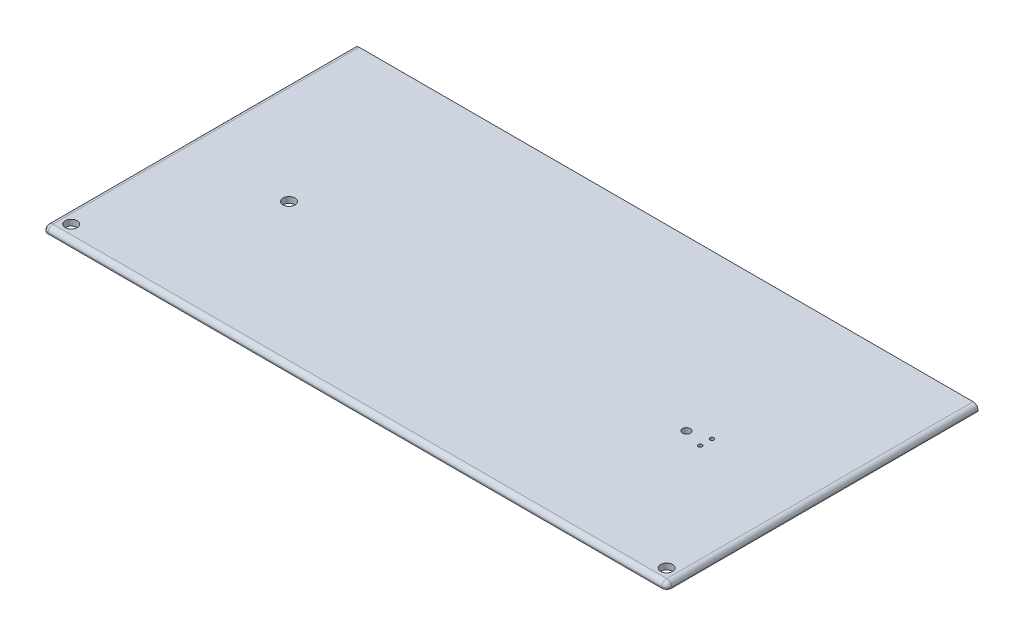
ISO-10303-21;
HEADER;
FILE_DESCRIPTION(('STEP AP214'),'2;1');
FILE_NAME('part.step','',(''),(''),'','','');
FILE_SCHEMA(('AUTOMOTIVE_DESIGN { 1 0 10303 214 1 1 1 1 }'));
ENDSEC;
DATA;
#1=APPLICATION_CONTEXT('core data for automotive mechanical design processes');
#2=APPLICATION_PROTOCOL_DEFINITION('international standard','automotive_design',2000,#1);
#3=PRODUCT_CONTEXT('',#1,'mechanical');
#4=PRODUCT('Part','Part','',(#3));
#5=PRODUCT_RELATED_PRODUCT_CATEGORY('part','',(#4));
#6=PRODUCT_DEFINITION_FORMATION('','',#4);
#7=PRODUCT_DEFINITION_CONTEXT('part definition',#1,'design');
#8=PRODUCT_DEFINITION('design','',#6,#7);
#9=PRODUCT_DEFINITION_SHAPE('','',#8);
#10=(LENGTH_UNIT() NAMED_UNIT(*) SI_UNIT(.MILLI.,.METRE.));
#11=(NAMED_UNIT(*) PLANE_ANGLE_UNIT() SI_UNIT($,.RADIAN.));
#12=(NAMED_UNIT(*) SI_UNIT($,.STERADIAN.) SOLID_ANGLE_UNIT());
#13=UNCERTAINTY_MEASURE_WITH_UNIT(LENGTH_MEASURE(1.E-05),#10,'distance_accuracy_value','');
#14=(GEOMETRIC_REPRESENTATION_CONTEXT(3) GLOBAL_UNCERTAINTY_ASSIGNED_CONTEXT((#13)) GLOBAL_UNIT_ASSIGNED_CONTEXT((#10,
#11,#12)) REPRESENTATION_CONTEXT('',''));
#15=CARTESIAN_POINT('',(0.,0.,0.));
#16=DIRECTION('',(0.,0.,1.));
#17=DIRECTION('',(1.,0.,0.));
#18=AXIS2_PLACEMENT_3D('',#15,#16,#17);
#19=CARTESIAN_POINT('',(79.25,-1.25,159.));
#20=DIRECTION('',(0.,0.,1.));
#21=DIRECTION('',(1.,0.,0.));
#22=AXIS2_PLACEMENT_3D('',#19,#20,#21);
#23=PLANE('',#22);
#24=DIRECTION('',(0.,1.,0.));
#25=VECTOR('',#24,1.);
#26=CARTESIAN_POINT('',(78.,-1.25,159.));
#27=LINE('',#26,#25);
#28=CARTESIAN_POINT('',(78.,105.,159.));
#29=VERTEX_POINT('',#28);
#30=CARTESIAN_POINT('',(78.,105.25,159.));
#31=VERTEX_POINT('',#30);
#32=EDGE_CURVE('E140',#29,#31,#27,.T.);
#33=ORIENTED_EDGE('',*,*,#32,.T.);
#34=DIRECTION('',(1.,0.,0.));
#35=VECTOR('',#34,1.);
#36=CARTESIAN_POINT('',(79.25,105.25,159.));
#37=LINE('',#36,#35);
#38=CARTESIAN_POINT('',(-78.,105.25,159.));
#39=VERTEX_POINT('',#38);
#40=EDGE_CURVE('E164',#31,#39,#37,.F.);
#41=ORIENTED_EDGE('',*,*,#40,.T.);
#42=DIRECTION('',(0.,1.,0.));
#43=VECTOR('',#42,1.);
#44=CARTESIAN_POINT('',(-78.,-1.25,159.));
#45=LINE('',#44,#43);
#46=CARTESIAN_POINT('',(-78.,105.,159.));
#47=VERTEX_POINT('',#46);
#48=EDGE_CURVE('E149',#39,#47,#45,.F.);
#49=ORIENTED_EDGE('',*,*,#48,.T.);
#50=DIRECTION('',(1.,0.,0.));
#51=VECTOR('',#50,1.);
#52=CARTESIAN_POINT('',(79.25,105.,159.));
#53=LINE('',#52,#51);
#54=EDGE_CURVE('E146',#47,#29,#53,.T.);
#55=ORIENTED_EDGE('',*,*,#54,.T.);
#56=EDGE_LOOP('',(#33,#41,#49,#55));
#57=FACE_BOUND('',#56,.T.);
#58=ADVANCED_FACE('F50',(#57),#23,.T.);
#59=CARTESIAN_POINT('',(-75.6806897577081,60.,155.430689757708));
#60=DIRECTION('',(0.,1.,0.));
#61=DIRECTION('',(0.,0.,1.));
#62=AXIS2_PLACEMENT_3D('',#59,#60,#61);
#63=CYLINDRICAL_SURFACE('',#62,1.525);
#64=CARTESIAN_POINT('',(-75.6806897577081,106.5,155.430689757708));
#65=DIRECTION('',(0.,1.,0.));
#66=DIRECTION('',(0.,0.,1.));
#67=AXIS2_PLACEMENT_3D('',#64,#65,#66);
#68=CIRCLE('',#67,1.525);
#69=CARTESIAN_POINT('',(-75.6806897577081,106.5,156.955689757708));
#70=VERTEX_POINT('',#69);
#71=EDGE_CURVE('E244',#70,#70,#68,.T.);
#72=ORIENTED_EDGE('',*,*,#71,.T.);
#73=EDGE_LOOP('',(#72));
#74=FACE_BOUND('',#73,.T.);
#75=CARTESIAN_POINT('',(-75.6806897577081,105.,155.430689757708));
#76=DIRECTION('',(0.,1.,0.));
#77=DIRECTION('',(0.,0.,1.));
#78=AXIS2_PLACEMENT_3D('',#75,#76,#77);
#79=CIRCLE('',#78,1.525);
#80=CARTESIAN_POINT('',(-75.6806897577081,105.,156.955689757708));
#81=VERTEX_POINT('',#80);
#82=EDGE_CURVE('E173',#81,#81,#79,.T.);
#83=ORIENTED_EDGE('',*,*,#82,.F.);
#84=EDGE_LOOP('',(#83));
#85=FACE_BOUND('',#84,.T.);
#86=ADVANCED_FACE('F251',(#74,#85),#63,.F.);
#87=CARTESIAN_POINT('',(75.6806897577081,60.,155.430689757708));
#88=DIRECTION('',(0.,1.,0.));
#89=DIRECTION('',(0.,0.,1.));
#90=AXIS2_PLACEMENT_3D('',#87,#88,#89);
#91=CYLINDRICAL_SURFACE('',#90,1.525);
#92=CARTESIAN_POINT('',(75.6806897577081,106.5,155.430689757708));
#93=DIRECTION('',(0.,-1.,0.));
#94=DIRECTION('',(0.,0.,-1.));
#95=AXIS2_PLACEMENT_3D('',#92,#93,#94);
#96=CIRCLE('',#95,1.525);
#97=CARTESIAN_POINT('',(75.6806897577081,106.5,153.905689757708));
#98=VERTEX_POINT('',#97);
#99=EDGE_CURVE('E238',#98,#98,#96,.T.);
#100=ORIENTED_EDGE('',*,*,#99,.F.);
#101=EDGE_LOOP('',(#100));
#102=FACE_BOUND('',#101,.T.);
#103=CARTESIAN_POINT('',(75.6806897577081,105.,155.430689757708));
#104=DIRECTION('',(0.,1.,0.));
#105=DIRECTION('',(0.,0.,1.));
#106=AXIS2_PLACEMENT_3D('',#103,#104,#105);
#107=CIRCLE('',#106,1.525);
#108=CARTESIAN_POINT('',(75.6806897577081,105.,156.955689757708));
#109=VERTEX_POINT('',#108);
#110=EDGE_CURVE('E241',#109,#109,#107,.F.);
#111=ORIENTED_EDGE('',*,*,#110,.T.);
#112=EDGE_LOOP('',(#111));
#113=FACE_BOUND('',#112,.T.);
#114=ADVANCED_FACE('F253',(#102,#113),#91,.F.);
#115=CARTESIAN_POINT('',(53.,60.,124.25));
#116=DIRECTION('',(0.,1.,0.));
#117=DIRECTION('',(0.,0.,1.));
#118=AXIS2_PLACEMENT_3D('',#115,#116,#117);
#119=CYLINDRICAL_SURFACE('',#118,0.499999999999999);
#120=CARTESIAN_POINT('',(53.,106.5,124.25));
#121=DIRECTION('',(0.,1.,0.));
#122=DIRECTION('',(0.,0.,1.));
#123=AXIS2_PLACEMENT_3D('',#120,#121,#122);
#124=CIRCLE('',#123,0.499999999999999);
#125=CARTESIAN_POINT('',(53.,106.5,124.75));
#126=VERTEX_POINT('',#125);
#127=EDGE_CURVE('E232',#126,#126,#124,.T.);
#128=ORIENTED_EDGE('',*,*,#127,.T.);
#129=EDGE_LOOP('',(#128));
#130=FACE_BOUND('',#129,.T.);
#131=CARTESIAN_POINT('',(53.,105.,124.25));
#132=DIRECTION('',(0.,1.,0.));
#133=DIRECTION('',(0.,0.,1.));
#134=AXIS2_PLACEMENT_3D('',#131,#132,#133);
#135=CIRCLE('',#134,0.499999999999999);
#136=CARTESIAN_POINT('',(53.,105.,124.75));
#137=VERTEX_POINT('',#136);
#138=EDGE_CURVE('E235',#137,#137,#135,.T.);
#139=ORIENTED_EDGE('',*,*,#138,.F.);
#140=EDGE_LOOP('',(#139));
#141=FACE_BOUND('',#140,.T.);
#142=ADVANCED_FACE('F260',(#130,#141),#119,.F.);
#143=CARTESIAN_POINT('',(-53.,60.,122.75));
#144=DIRECTION('',(0.,1.,0.));
#145=DIRECTION('',(0.,0.,1.));
#146=AXIS2_PLACEMENT_3D('',#143,#144,#145);
#147=CYLINDRICAL_SURFACE('',#146,1.525);
#148=CARTESIAN_POINT('',(-53.,106.5,122.75));
#149=DIRECTION('',(0.,1.,0.));
#150=DIRECTION('',(0.,0.,1.));
#151=AXIS2_PLACEMENT_3D('',#148,#149,#150);
#152=CIRCLE('',#151,1.525);
#153=CARTESIAN_POINT('',(-53.,106.5,124.275));
#154=VERTEX_POINT('',#153);
#155=EDGE_CURVE('E123',#154,#154,#152,.T.);
#156=ORIENTED_EDGE('',*,*,#155,.T.);
#157=EDGE_LOOP('',(#156));
#158=FACE_BOUND('',#157,.T.);
#159=CARTESIAN_POINT('',(-53.,105.,122.75));
#160=DIRECTION('',(0.,1.,0.));
#161=DIRECTION('',(0.,0.,1.));
#162=AXIS2_PLACEMENT_3D('',#159,#160,#161);
#163=CIRCLE('',#162,1.525);
#164=CARTESIAN_POINT('',(-53.,105.,124.275));
#165=VERTEX_POINT('',#164);
#166=EDGE_CURVE('E218',#165,#165,#163,.T.);
#167=ORIENTED_EDGE('',*,*,#166,.F.);
#168=EDGE_LOOP('',(#167));
#169=FACE_BOUND('',#168,.T.);
#170=ADVANCED_FACE('F317',(#158,#169),#147,.F.);
#171=CARTESIAN_POINT('',(48.,60.,122.75));
#172=DIRECTION('',(0.,1.,0.));
#173=DIRECTION('',(0.,0.,1.));
#174=AXIS2_PLACEMENT_3D('',#171,#172,#173);
#175=CYLINDRICAL_SURFACE('',#174,0.999999999999998);
#176=CARTESIAN_POINT('',(48.,106.5,122.75));
#177=DIRECTION('',(0.,1.,0.));
#178=DIRECTION('',(0.,0.,1.));
#179=AXIS2_PLACEMENT_3D('',#176,#177,#178);
#180=CIRCLE('',#179,0.999999999999998);
#181=CARTESIAN_POINT('',(48.,106.5,123.75));
#182=VERTEX_POINT('',#181);
#183=EDGE_CURVE('E219',#182,#182,#180,.T.);
#184=ORIENTED_EDGE('',*,*,#183,.T.);
#185=EDGE_LOOP('',(#184));
#186=FACE_BOUND('',#185,.T.);
#187=CARTESIAN_POINT('',(48.,105.,122.75));
#188=DIRECTION('',(0.,1.,0.));
#189=DIRECTION('',(0.,0.,1.));
#190=AXIS2_PLACEMENT_3D('',#187,#188,#189);
#191=CIRCLE('',#190,0.999999999999998);
#192=CARTESIAN_POINT('',(48.,105.,123.75));
#193=VERTEX_POINT('',#192);
#194=EDGE_CURVE('E226',#193,#193,#191,.T.);
#195=ORIENTED_EDGE('',*,*,#194,.F.);
#196=EDGE_LOOP('',(#195));
#197=FACE_BOUND('',#196,.T.);
#198=ADVANCED_FACE('F326',(#186,#197),#175,.F.);
#199=CARTESIAN_POINT('',(53.,60.,121.25));
#200=DIRECTION('',(0.,1.,0.));
#201=DIRECTION('',(0.,0.,1.));
#202=AXIS2_PLACEMENT_3D('',#199,#200,#201);
#203=CYLINDRICAL_SURFACE('',#202,0.499999999999999);
#204=CARTESIAN_POINT('',(53.,106.5,121.25));
#205=DIRECTION('',(0.,1.,0.));
#206=DIRECTION('',(0.,0.,1.));
#207=AXIS2_PLACEMENT_3D('',#204,#205,#206);
#208=CIRCLE('',#207,0.499999999999999);
#209=CARTESIAN_POINT('',(53.,106.5,121.75));
#210=VERTEX_POINT('',#209);
#211=EDGE_CURVE('E215',#210,#210,#208,.T.);
#212=ORIENTED_EDGE('',*,*,#211,.T.);
#213=EDGE_LOOP('',(#212));
#214=FACE_BOUND('',#213,.T.);
#215=CARTESIAN_POINT('',(53.,105.,121.25));
#216=DIRECTION('',(0.,1.,0.));
#217=DIRECTION('',(0.,0.,1.));
#218=AXIS2_PLACEMENT_3D('',#215,#216,#217);
#219=CIRCLE('',#218,0.499999999999999);
#220=CARTESIAN_POINT('',(53.,105.,121.75));
#221=VERTEX_POINT('',#220);
#222=EDGE_CURVE('E229',#221,#221,#219,.T.);
#223=ORIENTED_EDGE('',*,*,#222,.F.);
#224=EDGE_LOOP('',(#223));
#225=FACE_BOUND('',#224,.T.);
#226=ADVANCED_FACE('F336',(#214,#225),#203,.F.);
#227=CARTESIAN_POINT('',(-78.,105.25,157.75));
#228=DIRECTION('',(1.,0.,0.));
#229=DIRECTION('',(0.,0.,-1.));
#230=AXIS2_PLACEMENT_3D('',#227,#228,#229);
#231=CYLINDRICAL_SURFACE('',#230,1.25);
#232=CARTESIAN_POINT('',(-78.,105.25,157.75));
#233=DIRECTION('',(-1.,0.,0.));
#234=DIRECTION('',(0.,0.,1.));
#235=AXIS2_PLACEMENT_3D('',#232,#233,#234);
#236=CIRCLE('',#235,1.25);
#237=CARTESIAN_POINT('',(-78.,106.5,157.75));
#238=VERTEX_POINT('',#237);
#239=EDGE_CURVE('E176',#39,#238,#236,.T.);
#240=ORIENTED_EDGE('',*,*,#239,.F.);
#241=ORIENTED_EDGE('',*,*,#40,.F.);
#242=CARTESIAN_POINT('',(78.,105.25,157.75));
#243=DIRECTION('',(1.,0.,0.));
#244=DIRECTION('',(0.,0.,-1.));
#245=AXIS2_PLACEMENT_3D('',#242,#243,#244);
#246=CIRCLE('',#245,1.25);
#247=CARTESIAN_POINT('',(78.,106.5,157.75));
#248=VERTEX_POINT('',#247);
#249=EDGE_CURVE('E178',#248,#31,#246,.T.);
#250=ORIENTED_EDGE('',*,*,#249,.F.);
#251=DIRECTION('',(1.,0.,0.));
#252=VECTOR('',#251,1.);
#253=CARTESIAN_POINT('',(-78.,106.5,157.75));
#254=LINE('',#253,#252);
#255=EDGE_CURVE('E155',#238,#248,#254,.T.);
#256=ORIENTED_EDGE('',*,*,#255,.F.);
#257=EDGE_LOOP('',(#240,#241,#250,#256));
#258=FACE_BOUND('',#257,.T.);
#259=ADVANCED_FACE('F52',(#258),#231,.T.);
#260=CARTESIAN_POINT('',(78.,-1.25,157.75));
#261=DIRECTION('',(0.,1.,0.));
#262=DIRECTION('',(0.,0.,1.));
#263=AXIS2_PLACEMENT_3D('',#260,#261,#262);
#264=CYLINDRICAL_SURFACE('',#263,1.25);
#265=DIRECTION('',(0.,1.,0.));
#266=VECTOR('',#265,1.);
#267=CARTESIAN_POINT('',(79.25,-1.25,157.75));
#268=LINE('',#267,#266);
#269=CARTESIAN_POINT('',(79.25,105.25,157.75));
#270=VERTEX_POINT('',#269);
#271=CARTESIAN_POINT('',(79.25,105.,157.75));
#272=VERTEX_POINT('',#271);
#273=EDGE_CURVE('E136',#270,#272,#268,.F.);
#274=ORIENTED_EDGE('',*,*,#273,.F.);
#275=CARTESIAN_POINT('',(78.,105.25,157.75));
#276=DIRECTION('',(0.,1.,0.));
#277=DIRECTION('',(0.,0.,1.));
#278=AXIS2_PLACEMENT_3D('',#275,#276,#277);
#279=CIRCLE('',#278,1.25);
#280=EDGE_CURVE('E162',#270,#31,#279,.F.);
#281=ORIENTED_EDGE('',*,*,#280,.T.);
#282=ORIENTED_EDGE('',*,*,#32,.F.);
#283=CARTESIAN_POINT('',(78.,105.,157.75));
#284=DIRECTION('',(0.,-1.,0.));
#285=DIRECTION('',(0.,0.,-1.));
#286=AXIS2_PLACEMENT_3D('',#283,#284,#285);
#287=CIRCLE('',#286,1.25);
#288=EDGE_CURVE('E144',#29,#272,#287,.F.);
#289=ORIENTED_EDGE('',*,*,#288,.T.);
#290=EDGE_LOOP('',(#274,#281,#282,#289));
#291=FACE_BOUND('',#290,.T.);
#292=ADVANCED_FACE('F186',(#291),#264,.T.);
#293=CARTESIAN_POINT('',(-78.,-1.25,157.75));
#294=DIRECTION('',(0.,1.,0.));
#295=DIRECTION('',(0.,0.,1.));
#296=AXIS2_PLACEMENT_3D('',#293,#294,#295);
#297=CYLINDRICAL_SURFACE('',#296,1.25);
#298=ORIENTED_EDGE('',*,*,#48,.F.);
#299=CARTESIAN_POINT('',(-78.,105.25,157.75));
#300=DIRECTION('',(0.,1.,0.));
#301=DIRECTION('',(0.,0.,1.));
#302=AXIS2_PLACEMENT_3D('',#299,#300,#301);
#303=CIRCLE('',#302,1.25);
#304=CARTESIAN_POINT('',(-79.25,105.25,157.75));
#305=VERTEX_POINT('',#304);
#306=EDGE_CURVE('E72',#39,#305,#303,.F.);
#307=ORIENTED_EDGE('',*,*,#306,.T.);
#308=DIRECTION('',(0.,1.,0.));
#309=VECTOR('',#308,1.);
#310=CARTESIAN_POINT('',(-79.25,-1.25,157.75));
#311=LINE('',#310,#309);
#312=CARTESIAN_POINT('',(-79.25,105.,157.75));
#313=VERTEX_POINT('',#312);
#314=EDGE_CURVE('E138',#313,#305,#311,.T.);
#315=ORIENTED_EDGE('',*,*,#314,.F.);
#316=CARTESIAN_POINT('',(-78.,105.,157.75));
#317=DIRECTION('',(0.,-1.,0.));
#318=DIRECTION('',(0.,0.,-1.));
#319=AXIS2_PLACEMENT_3D('',#316,#317,#318);
#320=CIRCLE('',#319,1.25);
#321=EDGE_CURVE('E150',#313,#47,#320,.F.);
#322=ORIENTED_EDGE('',*,*,#321,.T.);
#323=EDGE_LOOP('',(#298,#307,#315,#322));
#324=FACE_BOUND('',#323,.T.);
#325=ADVANCED_FACE('F269',(#324),#297,.T.);
#326=CARTESIAN_POINT('',(78.,105.25,157.75));
#327=DIRECTION('',(0.,1.,0.));
#328=DIRECTION('',(0.,0.,1.));
#329=AXIS2_PLACEMENT_3D('',#326,#327,#328);
#330=SPHERICAL_SURFACE('',#329,1.25);
#331=ORIENTED_EDGE('',*,*,#249,.T.);
#332=ORIENTED_EDGE('',*,*,#280,.F.);
#333=CARTESIAN_POINT('',(78.,105.25,157.75));
#334=DIRECTION('',(0.,0.,-1.));
#335=DIRECTION('',(-1.,0.,0.));
#336=AXIS2_PLACEMENT_3D('',#333,#334,#335);
#337=CIRCLE('',#336,1.25);
#338=EDGE_CURVE('E172',#248,#270,#337,.T.);
#339=ORIENTED_EDGE('',*,*,#338,.F.);
#340=EDGE_LOOP('',(#331,#332,#339));
#341=FACE_BOUND('',#340,.T.);
#342=ADVANCED_FACE('F272',(#341),#330,.T.);
#343=CARTESIAN_POINT('',(-78.,105.25,157.75));
#344=DIRECTION('',(0.,1.,0.));
#345=DIRECTION('',(0.,0.,1.));
#346=AXIS2_PLACEMENT_3D('',#343,#344,#345);
#347=SPHERICAL_SURFACE('',#346,1.25);
#348=ORIENTED_EDGE('',*,*,#306,.F.);
#349=ORIENTED_EDGE('',*,*,#239,.T.);
#350=CARTESIAN_POINT('',(-78.,105.25,157.75));
#351=DIRECTION('',(0.,0.,-1.));
#352=DIRECTION('',(-1.,0.,0.));
#353=AXIS2_PLACEMENT_3D('',#350,#351,#352);
#354=CIRCLE('',#353,1.25);
#355=EDGE_CURVE('E169',#305,#238,#354,.T.);
#356=ORIENTED_EDGE('',*,*,#355,.F.);
#357=EDGE_LOOP('',(#348,#349,#356));
#358=FACE_BOUND('',#357,.T.);
#359=ADVANCED_FACE('F200',(#358),#347,.T.);
#360=CARTESIAN_POINT('',(78.,105.25,-34.75));
#361=DIRECTION('',(0.,0.,-1.));
#362=DIRECTION('',(-1.,0.,0.));
#363=AXIS2_PLACEMENT_3D('',#360,#361,#362);
#364=CYLINDRICAL_SURFACE('',#363,1.25);
#365=CARTESIAN_POINT('',(78.,105.25,79.8785531963141));
#366=DIRECTION('',(0.,0.,1.));
#367=DIRECTION('',(1.,0.,0.));
#368=AXIS2_PLACEMENT_3D('',#365,#366,#367);
#369=CIRCLE('',#368,1.25);
#370=CARTESIAN_POINT('',(78.,106.5,79.8785531963141));
#371=VERTEX_POINT('',#370);
#372=CARTESIAN_POINT('',(79.25,105.25,79.8785531963141));
#373=VERTEX_POINT('',#372);
#374=EDGE_CURVE('E119',#371,#373,#369,.F.);
#375=ORIENTED_EDGE('',*,*,#374,.F.);
#376=DIRECTION('',(0.,0.,-1.));
#377=VECTOR('',#376,1.);
#378=CARTESIAN_POINT('',(78.,106.5,-34.75));
#379=LINE('',#378,#377);
#380=EDGE_CURVE('E157',#248,#371,#379,.T.);
#381=ORIENTED_EDGE('',*,*,#380,.F.);
#382=ORIENTED_EDGE('',*,*,#338,.T.);
#383=DIRECTION('',(0.,0.,-1.));
#384=VECTOR('',#383,1.);
#385=CARTESIAN_POINT('',(79.25,105.25,-36.));
#386=LINE('',#385,#384);
#387=EDGE_CURVE('E160',#373,#270,#386,.F.);
#388=ORIENTED_EDGE('',*,*,#387,.F.);
#389=EDGE_LOOP('',(#375,#381,#382,#388));
#390=FACE_BOUND('',#389,.T.);
#391=ADVANCED_FACE('F277',(#390),#364,.T.);
#392=CARTESIAN_POINT('',(79.25,-1.25,-36.));
#393=DIRECTION('',(1.,0.,0.));
#394=DIRECTION('',(0.,0.,-1.));
#395=AXIS2_PLACEMENT_3D('',#392,#393,#394);
#396=PLANE('',#395);
#397=DIRECTION('',(0.,-1.,0.));
#398=VECTOR('',#397,1.);
#399=CARTESIAN_POINT('',(79.25,-1.25,79.8785531963141));
#400=LINE('',#399,#398);
#401=CARTESIAN_POINT('',(79.25,105.,79.8785531963141));
#402=VERTEX_POINT('',#401);
#403=EDGE_CURVE('E114',#373,#402,#400,.T.);
#404=ORIENTED_EDGE('',*,*,#403,.F.);
#405=ORIENTED_EDGE('',*,*,#387,.T.);
#406=ORIENTED_EDGE('',*,*,#273,.T.);
#407=DIRECTION('',(0.,0.,-1.));
#408=VECTOR('',#407,1.);
#409=CARTESIAN_POINT('',(79.25,105.,-36.));
#410=LINE('',#409,#408);
#411=EDGE_CURVE('E129',#272,#402,#410,.T.);
#412=ORIENTED_EDGE('',*,*,#411,.T.);
#413=EDGE_LOOP('',(#404,#405,#406,#412));
#414=FACE_BOUND('',#413,.T.);
#415=ADVANCED_FACE('F134',(#414),#396,.T.);
#416=CARTESIAN_POINT('',(-78.,105.25,-34.75));
#417=DIRECTION('',(0.,0.,1.));
#418=DIRECTION('',(1.,0.,0.));
#419=AXIS2_PLACEMENT_3D('',#416,#417,#418);
#420=CYLINDRICAL_SURFACE('',#419,1.25);
#421=CARTESIAN_POINT('',(-78.,105.25,79.8785531963141));
#422=DIRECTION('',(0.,0.,1.));
#423=DIRECTION('',(1.,0.,0.));
#424=AXIS2_PLACEMENT_3D('',#421,#422,#423);
#425=CIRCLE('',#424,1.25);
#426=CARTESIAN_POINT('',(-79.25,105.25,79.8785531963141));
#427=VERTEX_POINT('',#426);
#428=CARTESIAN_POINT('',(-78.,106.5,79.8785531963141));
#429=VERTEX_POINT('',#428);
#430=EDGE_CURVE('E12',#427,#429,#425,.F.);
#431=ORIENTED_EDGE('',*,*,#430,.F.);
#432=DIRECTION('',(0.,0.,1.));
#433=VECTOR('',#432,1.);
#434=CARTESIAN_POINT('',(-79.25,105.25,159.));
#435=LINE('',#434,#433);
#436=EDGE_CURVE('E58',#305,#427,#435,.F.);
#437=ORIENTED_EDGE('',*,*,#436,.F.);
#438=ORIENTED_EDGE('',*,*,#355,.T.);
#439=DIRECTION('',(0.,0.,1.));
#440=VECTOR('',#439,1.);
#441=CARTESIAN_POINT('',(-78.,106.5,-34.75));
#442=LINE('',#441,#440);
#443=EDGE_CURVE('E153',#429,#238,#442,.T.);
#444=ORIENTED_EDGE('',*,*,#443,.F.);
#445=EDGE_LOOP('',(#431,#437,#438,#444));
#446=FACE_BOUND('',#445,.T.);
#447=ADVANCED_FACE('F203',(#446),#420,.T.);
#448=CARTESIAN_POINT('',(-79.25,-1.25,159.));
#449=DIRECTION('',(-1.,0.,0.));
#450=DIRECTION('',(0.,0.,1.));
#451=AXIS2_PLACEMENT_3D('',#448,#449,#450);
#452=PLANE('',#451);
#453=DIRECTION('',(0.,1.,0.));
#454=VECTOR('',#453,1.);
#455=CARTESIAN_POINT('',(-79.25,-1.25,79.8785531963141));
#456=LINE('',#455,#454);
#457=CARTESIAN_POINT('',(-79.25,105.,79.8785531963141));
#458=VERTEX_POINT('',#457);
#459=EDGE_CURVE('E64',#458,#427,#456,.T.);
#460=ORIENTED_EDGE('',*,*,#459,.F.);
#461=DIRECTION('',(0.,0.,1.));
#462=VECTOR('',#461,1.);
#463=CARTESIAN_POINT('',(-79.25,105.,159.));
#464=LINE('',#463,#462);
#465=EDGE_CURVE('E132',#458,#313,#464,.T.);
#466=ORIENTED_EDGE('',*,*,#465,.T.);
#467=ORIENTED_EDGE('',*,*,#314,.T.);
#468=ORIENTED_EDGE('',*,*,#436,.T.);
#469=EDGE_LOOP('',(#460,#466,#467,#468));
#470=FACE_BOUND('',#469,.T.);
#471=ADVANCED_FACE('F197',(#470),#452,.T.);
#472=CARTESIAN_POINT('',(-78.,106.5,-34.75));
#473=DIRECTION('',(0.,1.,0.));
#474=DIRECTION('',(0.,0.,1.));
#475=AXIS2_PLACEMENT_3D('',#472,#473,#474);
#476=PLANE('',#475);
#477=DIRECTION('',(1.,0.,0.));
#478=VECTOR('',#477,1.);
#479=CARTESIAN_POINT('',(-78.,106.5,79.8785531963141));
#480=LINE('',#479,#478);
#481=EDGE_CURVE('E205',#429,#371,#480,.T.);
#482=ORIENTED_EDGE('',*,*,#481,.F.);
#483=ORIENTED_EDGE('',*,*,#443,.T.);
#484=ORIENTED_EDGE('',*,*,#255,.T.);
#485=ORIENTED_EDGE('',*,*,#380,.T.);
#486=EDGE_LOOP('',(#482,#483,#484,#485));
#487=FACE_BOUND('',#486,.T.);
#488=ORIENTED_EDGE('',*,*,#211,.F.);
#489=EDGE_LOOP('',(#488));
#490=FACE_BOUND('',#489,.T.);
#491=ORIENTED_EDGE('',*,*,#183,.F.);
#492=EDGE_LOOP('',(#491));
#493=FACE_BOUND('',#492,.T.);
#494=ORIENTED_EDGE('',*,*,#155,.F.);
#495=EDGE_LOOP('',(#494));
#496=FACE_BOUND('',#495,.T.);
#497=ORIENTED_EDGE('',*,*,#127,.F.);
#498=EDGE_LOOP('',(#497));
#499=FACE_BOUND('',#498,.T.);
#500=ORIENTED_EDGE('',*,*,#99,.T.);
#501=EDGE_LOOP('',(#500));
#502=FACE_BOUND('',#501,.T.);
#503=ORIENTED_EDGE('',*,*,#71,.F.);
#504=EDGE_LOOP('',(#503));
#505=FACE_BOUND('',#504,.T.);
#506=ADVANCED_FACE('F207',(#487,#490,#493,#496,#499,#502,#505),#476,.T.);
#507=CARTESIAN_POINT('',(-78.,105.,-34.75));
#508=DIRECTION('',(0.,1.,0.));
#509=DIRECTION('',(0.,0.,1.));
#510=AXIS2_PLACEMENT_3D('',#507,#508,#509);
#511=PLANE('',#510);
#512=ORIENTED_EDGE('',*,*,#82,.T.);
#513=EDGE_LOOP('',(#512));
#514=FACE_BOUND('',#513,.T.);
#515=ORIENTED_EDGE('',*,*,#110,.F.);
#516=EDGE_LOOP('',(#515));
#517=FACE_BOUND('',#516,.T.);
#518=ORIENTED_EDGE('',*,*,#138,.T.);
#519=EDGE_LOOP('',(#518));
#520=FACE_BOUND('',#519,.T.);
#521=ORIENTED_EDGE('',*,*,#166,.T.);
#522=EDGE_LOOP('',(#521));
#523=FACE_BOUND('',#522,.T.);
#524=ORIENTED_EDGE('',*,*,#194,.T.);
#525=EDGE_LOOP('',(#524));
#526=FACE_BOUND('',#525,.T.);
#527=ORIENTED_EDGE('',*,*,#222,.T.);
#528=EDGE_LOOP('',(#527));
#529=FACE_BOUND('',#528,.T.);
#530=ORIENTED_EDGE('',*,*,#465,.F.);
#531=DIRECTION('',(-1.,0.,0.));
#532=VECTOR('',#531,1.);
#533=CARTESIAN_POINT('',(-106.425872023729,105.,79.8785531963141));
#534=LINE('',#533,#532);
#535=EDGE_CURVE('E117',#402,#458,#534,.T.);
#536=ORIENTED_EDGE('',*,*,#535,.F.);
#537=ORIENTED_EDGE('',*,*,#411,.F.);
#538=ORIENTED_EDGE('',*,*,#288,.F.);
#539=ORIENTED_EDGE('',*,*,#54,.F.);
#540=ORIENTED_EDGE('',*,*,#321,.F.);
#541=EDGE_LOOP('',(#530,#536,#537,#538,#539,#540));
#542=FACE_BOUND('',#541,.T.);
#543=ADVANCED_FACE('F128',(#514,#517,#520,#523,#526,#529,#542),#511,.F.);
#544=CARTESIAN_POINT('',(-106.425872023729,213.,79.8785531963141));
#545=DIRECTION('',(0.,0.,1.));
#546=DIRECTION('',(1.,0.,0.));
#547=AXIS2_PLACEMENT_3D('',#544,#545,#546);
#548=PLANE('',#547);
#549=ORIENTED_EDGE('',*,*,#403,.T.);
#550=ORIENTED_EDGE('',*,*,#535,.T.);
#551=ORIENTED_EDGE('',*,*,#459,.T.);
#552=ORIENTED_EDGE('',*,*,#430,.T.);
#553=ORIENTED_EDGE('',*,*,#481,.T.);
#554=ORIENTED_EDGE('',*,*,#374,.T.);
#555=EDGE_LOOP('',(#549,#550,#551,#552,#553,#554));
#556=FACE_BOUND('',#555,.T.);
#557=ADVANCED_FACE('F116',(#556),#548,.F.);
#558=CLOSED_SHELL('',(#58,#86,#114,#142,#170,#198,#226,#259,#292,#325,#342,#359,#391,#415,#447,
#471,#506,#543,#557));
#559=MANIFOLD_SOLID_BREP('B2',#558);
#560=ADVANCED_BREP_SHAPE_REPRESENTATION('',(#18,#559),#14);
#561=SHAPE_DEFINITION_REPRESENTATION(#9,#560);
ENDSEC;
END-ISO-10303-21;
